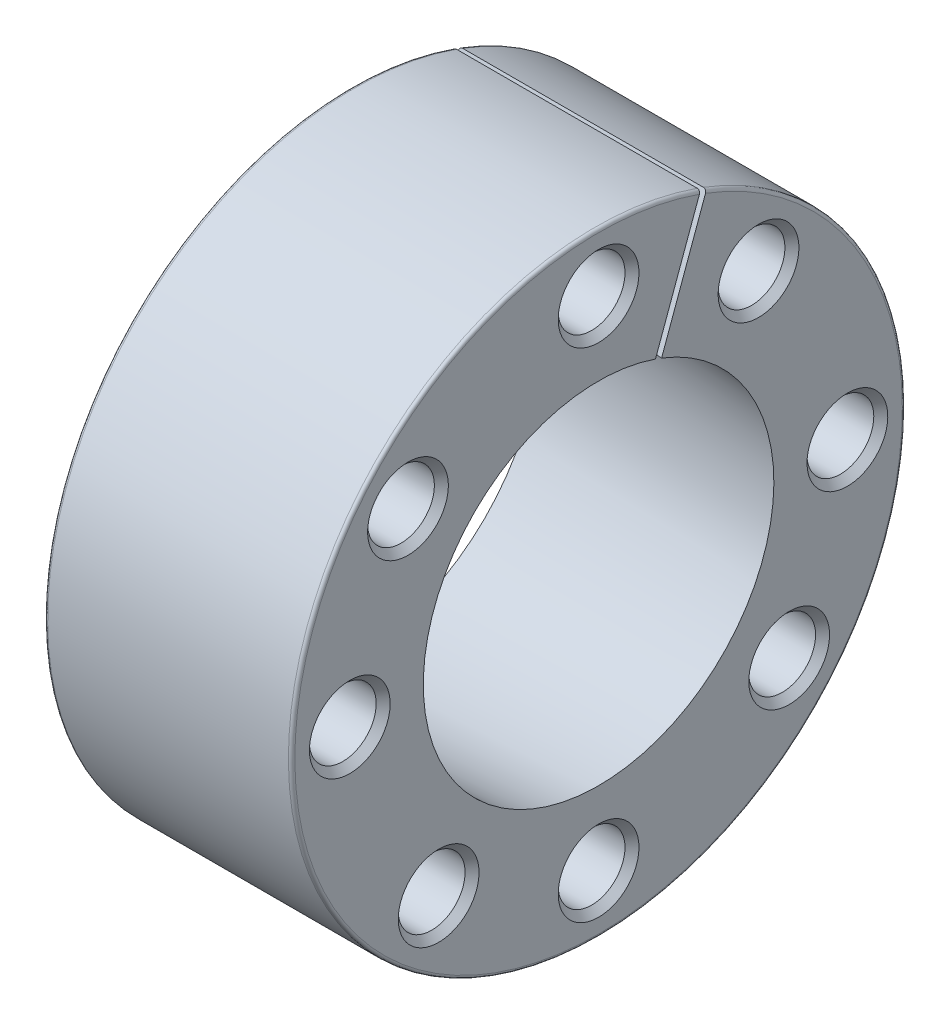
ISO-10303-21;
HEADER;
FILE_DESCRIPTION(('STEP AP214'),'2;1');
FILE_NAME('part.step','',(''),(''),'','','');
FILE_SCHEMA(('AUTOMOTIVE_DESIGN { 1 0 10303 214 1 1 1 1 }'));
ENDSEC;
DATA;
#1=APPLICATION_CONTEXT('core data for automotive mechanical design processes');
#2=APPLICATION_PROTOCOL_DEFINITION('international standard','automotive_design',2000,#1);
#3=PRODUCT_CONTEXT('',#1,'mechanical');
#4=PRODUCT('Part','Part','',(#3));
#5=PRODUCT_RELATED_PRODUCT_CATEGORY('part','',(#4));
#6=PRODUCT_DEFINITION_FORMATION('','',#4);
#7=PRODUCT_DEFINITION_CONTEXT('part definition',#1,'design');
#8=PRODUCT_DEFINITION('design','',#6,#7);
#9=PRODUCT_DEFINITION_SHAPE('','',#8);
#10=(LENGTH_UNIT() NAMED_UNIT(*) SI_UNIT(.MILLI.,.METRE.));
#11=(NAMED_UNIT(*) PLANE_ANGLE_UNIT() SI_UNIT($,.RADIAN.));
#12=(NAMED_UNIT(*) SI_UNIT($,.STERADIAN.) SOLID_ANGLE_UNIT());
#13=UNCERTAINTY_MEASURE_WITH_UNIT(LENGTH_MEASURE(1.E-05),#10,'distance_accuracy_value','');
#14=(GEOMETRIC_REPRESENTATION_CONTEXT(3) GLOBAL_UNCERTAINTY_ASSIGNED_CONTEXT((#13)) GLOBAL_UNIT_ASSIGNED_CONTEXT((#10,
#11,#12)) REPRESENTATION_CONTEXT('',''));
#15=CARTESIAN_POINT('',(0.,0.,0.));
#16=DIRECTION('',(0.,0.,1.));
#17=DIRECTION('',(1.,0.,0.));
#18=AXIS2_PLACEMENT_3D('',#15,#16,#17);
#19=CARTESIAN_POINT('',(24.1,15.4,0.));
#20=DIRECTION('',(-1.,0.,0.));
#21=DIRECTION('',(0.,0.,1.));
#22=AXIS2_PLACEMENT_3D('',#19,#20,#21);
#23=CYLINDRICAL_SURFACE('',#22,2.067);
#24=CARTESIAN_POINT('',(9.23299999999472,15.4,0.));
#25=DIRECTION('',(-1.,0.,0.));
#26=DIRECTION('',(0.,0.,1.));
#27=AXIS2_PLACEMENT_3D('',#24,#25,#26);
#28=CIRCLE('',#27,2.06700000001092);
#29=CARTESIAN_POINT('',(9.23299999999472,15.4,2.06700000001092));
#30=VERTEX_POINT('',#29);
#31=EDGE_CURVE('E222',#30,#30,#28,.T.);
#32=ORIENTED_EDGE('',*,*,#31,.T.);
#33=EDGE_LOOP('',(#32));
#34=FACE_BOUND('',#33,.T.);
#35=CARTESIAN_POINT('',(23.6669999999322,15.4,0.));
#36=DIRECTION('',(1.,0.,0.));
#37=DIRECTION('',(0.,0.,-1.));
#38=AXIS2_PLACEMENT_3D('',#35,#36,#37);
#39=CIRCLE('',#38,2.06700000001092);
#40=CARTESIAN_POINT('',(23.6669999999322,15.4,-2.06700000001092));
#41=VERTEX_POINT('',#40);
#42=EDGE_CURVE('E182',#41,#41,#39,.T.);
#43=ORIENTED_EDGE('',*,*,#42,.T.);
#44=EDGE_LOOP('',(#43));
#45=FACE_BOUND('',#44,.T.);
#46=ADVANCED_FACE('F16',(#34,#45),#23,.F.);
#47=CARTESIAN_POINT('',(24.1,11.7970844240323,-9.8989291891727));
#48=DIRECTION('',(-1.,0.,0.));
#49=DIRECTION('',(0.,0.,1.));
#50=AXIS2_PLACEMENT_3D('',#47,#48,#49);
#51=CYLINDRICAL_SURFACE('',#50,2.067);
#52=CARTESIAN_POINT('',(9.23299999993787,11.7970844240323,-9.8989291891727));
#53=DIRECTION('',(-1.,0.,0.));
#54=DIRECTION('',(0.,0.,1.));
#55=AXIS2_PLACEMENT_3D('',#52,#53,#54);
#56=CIRCLE('',#55,2.06700000003514);
#57=CARTESIAN_POINT('',(9.23299999993787,11.7970844240323,-7.83192918913755));
#58=VERTEX_POINT('',#57);
#59=EDGE_CURVE('E217',#58,#58,#56,.T.);
#60=ORIENTED_EDGE('',*,*,#59,.T.);
#61=EDGE_LOOP('',(#60));
#62=FACE_BOUND('',#61,.T.);
#63=CARTESIAN_POINT('',(23.6669999999322,11.7970844240323,-9.8989291891727));
#64=DIRECTION('',(1.,0.,0.));
#65=DIRECTION('',(0.,0.,-1.));
#66=AXIS2_PLACEMENT_3D('',#63,#64,#65);
#67=CIRCLE('',#66,2.06700000004354);
#68=CARTESIAN_POINT('',(23.6669999999322,11.7970844240323,-11.9659291892162));
#69=VERTEX_POINT('',#68);
#70=EDGE_CURVE('E177',#69,#69,#67,.T.);
#71=ORIENTED_EDGE('',*,*,#70,.T.);
#72=EDGE_LOOP('',(#71));
#73=FACE_BOUND('',#72,.T.);
#74=ADVANCED_FACE('F359',(#62,#73),#51,.F.);
#75=CARTESIAN_POINT('',(24.1,-9.8989291891727,-11.7970844240323));
#76=DIRECTION('',(-1.,0.,0.));
#77=DIRECTION('',(0.,0.,1.));
#78=AXIS2_PLACEMENT_3D('',#75,#76,#77);
#79=CYLINDRICAL_SURFACE('',#78,2.067);
#80=CARTESIAN_POINT('',(9.23299999999472,-9.8989291891727,-11.7970844240323));
#81=DIRECTION('',(-1.,0.,0.));
#82=DIRECTION('',(0.,0.,1.));
#83=AXIS2_PLACEMENT_3D('',#80,#81,#82);
#84=CIRCLE('',#83,2.06699999991192);
#85=CARTESIAN_POINT('',(9.23299999999472,-9.8989291891727,-9.73008442412038));
#86=VERTEX_POINT('',#85);
#87=EDGE_CURVE('E212',#86,#86,#84,.T.);
#88=ORIENTED_EDGE('',*,*,#87,.T.);
#89=EDGE_LOOP('',(#88));
#90=FACE_BOUND('',#89,.T.);
#91=CARTESIAN_POINT('',(23.6669999999322,-9.8989291891727,-11.7970844240323));
#92=DIRECTION('',(1.,0.,0.));
#93=DIRECTION('',(0.,0.,-1.));
#94=AXIS2_PLACEMENT_3D('',#91,#92,#93);
#95=CIRCLE('',#94,2.06700000005308);
#96=CARTESIAN_POINT('',(23.6669999999322,-9.8989291891727,-13.8640844240854));
#97=VERTEX_POINT('',#96);
#98=EDGE_CURVE('E172',#97,#97,#95,.T.);
#99=ORIENTED_EDGE('',*,*,#98,.T.);
#100=EDGE_LOOP('',(#99));
#101=FACE_BOUND('',#100,.T.);
#102=ADVANCED_FACE('F356',(#90,#101),#79,.F.);
#103=CARTESIAN_POINT('',(24.1,-11.7970844240323,9.8989291891727));
#104=DIRECTION('',(-1.,0.,0.));
#105=DIRECTION('',(0.,0.,1.));
#106=AXIS2_PLACEMENT_3D('',#103,#104,#105);
#107=CYLINDRICAL_SURFACE('',#106,2.067);
#108=CARTESIAN_POINT('',(9.23299999999472,-11.7970844240323,9.8989291891727));
#109=DIRECTION('',(-1.,0.,0.));
#110=DIRECTION('',(0.,0.,1.));
#111=AXIS2_PLACEMENT_3D('',#108,#109,#110);
#112=CIRCLE('',#111,2.06699999992985);
#113=CARTESIAN_POINT('',(9.23299999999472,-11.7970844240323,11.9659291891026));
#114=VERTEX_POINT('',#113);
#115=EDGE_CURVE('E207',#114,#114,#112,.T.);
#116=ORIENTED_EDGE('',*,*,#115,.T.);
#117=EDGE_LOOP('',(#116));
#118=FACE_BOUND('',#117,.T.);
#119=CARTESIAN_POINT('',(23.6669999999322,-11.7970844240323,9.8989291891727));
#120=DIRECTION('',(1.,0.,0.));
#121=DIRECTION('',(0.,0.,-1.));
#122=AXIS2_PLACEMENT_3D('',#119,#120,#121);
#123=CIRCLE('',#122,2.06700000003514);
#124=CARTESIAN_POINT('',(23.6669999999322,-11.7970844240323,7.83192918913755));
#125=VERTEX_POINT('',#124);
#126=EDGE_CURVE('E167',#125,#125,#123,.T.);
#127=ORIENTED_EDGE('',*,*,#126,.T.);
#128=EDGE_LOOP('',(#127));
#129=FACE_BOUND('',#128,.T.);
#130=ADVANCED_FACE('F352',(#118,#129),#107,.F.);
#131=CARTESIAN_POINT('',(24.1,9.8989291891727,11.7970844240323));
#132=DIRECTION('',(-1.,0.,0.));
#133=DIRECTION('',(0.,0.,1.));
#134=AXIS2_PLACEMENT_3D('',#131,#132,#133);
#135=CYLINDRICAL_SURFACE('',#134,2.067);
#136=CARTESIAN_POINT('',(9.23299999993787,9.8989291891727,11.7970844240323));
#137=DIRECTION('',(-1.,0.,0.));
#138=DIRECTION('',(0.,0.,1.));
#139=AXIS2_PLACEMENT_3D('',#136,#137,#138);
#140=CIRCLE('',#139,2.06699999999623);
#141=CARTESIAN_POINT('',(9.23299999993787,9.8989291891727,13.8640844240285));
#142=VERTEX_POINT('',#141);
#143=EDGE_CURVE('E202',#142,#142,#140,.T.);
#144=ORIENTED_EDGE('',*,*,#143,.T.);
#145=EDGE_LOOP('',(#144));
#146=FACE_BOUND('',#145,.T.);
#147=CARTESIAN_POINT('',(23.6669999999322,9.8989291891727,11.7970844240323));
#148=DIRECTION('',(1.,0.,0.));
#149=DIRECTION('',(0.,0.,-1.));
#150=AXIS2_PLACEMENT_3D('',#147,#148,#149);
#151=CIRCLE('',#150,2.06700000008245);
#152=CARTESIAN_POINT('',(23.6669999999322,9.8989291891727,9.73008442394985));
#153=VERTEX_POINT('',#152);
#154=EDGE_CURVE('E162',#153,#153,#151,.T.);
#155=ORIENTED_EDGE('',*,*,#154,.T.);
#156=EDGE_LOOP('',(#155));
#157=FACE_BOUND('',#156,.T.);
#158=ADVANCED_FACE('F348',(#146,#157),#135,.F.);
#159=CARTESIAN_POINT('',(24.1,0.,15.4));
#160=DIRECTION('',(-1.,0.,0.));
#161=DIRECTION('',(0.,0.,1.));
#162=AXIS2_PLACEMENT_3D('',#159,#160,#161);
#163=CYLINDRICAL_SURFACE('',#162,2.067);
#164=CARTESIAN_POINT('',(9.23299999999472,0.,15.4));
#165=DIRECTION('',(-1.,0.,0.));
#166=DIRECTION('',(0.,0.,1.));
#167=AXIS2_PLACEMENT_3D('',#164,#165,#166);
#168=CIRCLE('',#167,2.06700000001056);
#169=CARTESIAN_POINT('',(9.23299999999472,0.,17.4670000000106));
#170=VERTEX_POINT('',#169);
#171=EDGE_CURVE('E197',#170,#170,#168,.T.);
#172=ORIENTED_EDGE('',*,*,#171,.T.);
#173=EDGE_LOOP('',(#172));
#174=FACE_BOUND('',#173,.T.);
#175=CARTESIAN_POINT('',(23.6669999999322,0.,15.4));
#176=DIRECTION('',(1.,0.,0.));
#177=DIRECTION('',(0.,0.,-1.));
#178=AXIS2_PLACEMENT_3D('',#175,#176,#177);
#179=CIRCLE('',#178,2.06700000006813);
#180=CARTESIAN_POINT('',(23.6669999999322,0.,13.3329999999319));
#181=VERTEX_POINT('',#180);
#182=EDGE_CURVE('E157',#181,#181,#179,.T.);
#183=ORIENTED_EDGE('',*,*,#182,.T.);
#184=EDGE_LOOP('',(#183));
#185=FACE_BOUND('',#184,.T.);
#186=ADVANCED_FACE('F344',(#174,#185),#163,.F.);
#187=CARTESIAN_POINT('',(24.1,-15.4,0.));
#188=DIRECTION('',(-1.,0.,0.));
#189=DIRECTION('',(0.,0.,1.));
#190=AXIS2_PLACEMENT_3D('',#187,#188,#189);
#191=CYLINDRICAL_SURFACE('',#190,2.067);
#192=CARTESIAN_POINT('',(9.23299999999472,-15.4,0.));
#193=DIRECTION('',(-1.,0.,0.));
#194=DIRECTION('',(0.,0.,1.));
#195=AXIS2_PLACEMENT_3D('',#192,#193,#194);
#196=CIRCLE('',#195,2.06700000001092);
#197=CARTESIAN_POINT('',(9.23299999999472,-15.4,2.06700000001092));
#198=VERTEX_POINT('',#197);
#199=EDGE_CURVE('E192',#198,#198,#196,.T.);
#200=ORIENTED_EDGE('',*,*,#199,.T.);
#201=EDGE_LOOP('',(#200));
#202=FACE_BOUND('',#201,.T.);
#203=CARTESIAN_POINT('',(23.6669999999322,-15.4,0.));
#204=DIRECTION('',(1.,0.,0.));
#205=DIRECTION('',(0.,0.,-1.));
#206=AXIS2_PLACEMENT_3D('',#203,#204,#205);
#207=CIRCLE('',#206,2.06700000001092);
#208=CARTESIAN_POINT('',(23.6669999999322,-15.4,-2.06700000001092));
#209=VERTEX_POINT('',#208);
#210=EDGE_CURVE('E152',#209,#209,#207,.T.);
#211=ORIENTED_EDGE('',*,*,#210,.T.);
#212=EDGE_LOOP('',(#211));
#213=FACE_BOUND('',#212,.T.);
#214=ADVANCED_FACE('F340',(#202,#213),#191,.F.);
#215=CARTESIAN_POINT('',(24.1,0.,-15.4));
#216=DIRECTION('',(-1.,0.,0.));
#217=DIRECTION('',(0.,0.,1.));
#218=AXIS2_PLACEMENT_3D('',#215,#216,#217);
#219=CYLINDRICAL_SURFACE('',#218,2.067);
#220=CARTESIAN_POINT('',(9.23299999993787,0.,-15.4));
#221=DIRECTION('',(-1.,0.,0.));
#222=DIRECTION('',(0.,0.,1.));
#223=AXIS2_PLACEMENT_3D('',#220,#221,#222);
#224=CIRCLE('',#223,2.06700000001129);
#225=CARTESIAN_POINT('',(9.23299999993787,0.,-13.3329999999887));
#226=VERTEX_POINT('',#225);
#227=EDGE_CURVE('E187',#226,#226,#224,.T.);
#228=ORIENTED_EDGE('',*,*,#227,.T.);
#229=EDGE_LOOP('',(#228));
#230=FACE_BOUND('',#229,.T.);
#231=CARTESIAN_POINT('',(23.6669999999322,0.,-15.4));
#232=DIRECTION('',(1.,0.,0.));
#233=DIRECTION('',(0.,0.,-1.));
#234=AXIS2_PLACEMENT_3D('',#231,#232,#233);
#235=CIRCLE('',#234,2.0670000000674);
#236=CARTESIAN_POINT('',(23.6669999999322,0.,-17.4670000000674));
#237=VERTEX_POINT('',#236);
#238=EDGE_CURVE('E144',#237,#237,#235,.T.);
#239=ORIENTED_EDGE('',*,*,#238,.T.);
#240=EDGE_LOOP('',(#239));
#241=FACE_BOUND('',#240,.T.);
#242=ADVANCED_FACE('F336',(#230,#241),#219,.F.);
#243=CARTESIAN_POINT('',(8.79999999995107,15.4,0.));
#244=DIRECTION('',(-1.,0.,0.));
#245=DIRECTION('',(0.,0.,1.));
#246=AXIS2_PLACEMENT_3D('',#243,#244,#245);
#247=CONICAL_SURFACE('',#246,2.50000000005457,0.785398163397448);
#248=CARTESIAN_POINT('',(8.79999999995107,15.4,0.));
#249=DIRECTION('',(-1.,0.,0.));
#250=DIRECTION('',(0.,0.,1.));
#251=AXIS2_PLACEMENT_3D('',#248,#249,#250);
#252=CIRCLE('',#251,2.50000000005457);
#253=CARTESIAN_POINT('',(8.79999999995107,15.4,2.50000000005457));
#254=VERTEX_POINT('',#253);
#255=EDGE_CURVE('E19',#254,#254,#252,.F.);
#256=ORIENTED_EDGE('',*,*,#255,.F.);
#257=EDGE_LOOP('',(#256));
#258=FACE_BOUND('',#257,.T.);
#259=ORIENTED_EDGE('',*,*,#31,.F.);
#260=EDGE_LOOP('',(#259));
#261=FACE_BOUND('',#260,.T.);
#262=ADVANCED_FACE('F332',(#258,#261),#247,.F.);
#263=CARTESIAN_POINT('',(8.8000000001216,11.7970844240323,-9.8989291891727));
#264=DIRECTION('',(-1.,0.,0.));
#265=DIRECTION('',(0.,0.,1.));
#266=AXIS2_PLACEMENT_3D('',#263,#264,#265);
#267=CONICAL_SURFACE('',#266,2.49999999990826,0.785398163397448);
#268=CARTESIAN_POINT('',(8.80000000000791,11.7970844240323,-9.8989291891727));
#269=DIRECTION('',(-1.,0.,0.));
#270=DIRECTION('',(0.,0.,1.));
#271=AXIS2_PLACEMENT_3D('',#268,#269,#270);
#272=CIRCLE('',#271,2.50000000002195);
#273=CARTESIAN_POINT('',(8.80000000000791,11.7970844240323,-7.39892918915075));
#274=VERTEX_POINT('',#273);
#275=EDGE_CURVE('E429',#274,#274,#272,.F.);
#276=ORIENTED_EDGE('',*,*,#275,.F.);
#277=EDGE_LOOP('',(#276));
#278=FACE_BOUND('',#277,.T.);
#279=ORIENTED_EDGE('',*,*,#59,.F.);
#280=EDGE_LOOP('',(#279));
#281=FACE_BOUND('',#280,.T.);
#282=ADVANCED_FACE('F328',(#278,#281),#267,.F.);
#283=CARTESIAN_POINT('',(8.80000000006476,-9.8989291891727,-11.7970844240323));
#284=DIRECTION('',(-1.,0.,0.));
#285=DIRECTION('',(0.,0.,1.));
#286=AXIS2_PLACEMENT_3D('',#283,#284,#285);
#287=CONICAL_SURFACE('',#286,2.49999999984189,0.785398163397448);
#288=CARTESIAN_POINT('',(8.80000000000791,-9.8989291891727,-11.7970844240323));
#289=DIRECTION('',(-1.,0.,0.));
#290=DIRECTION('',(0.,0.,1.));
#291=AXIS2_PLACEMENT_3D('',#288,#289,#290);
#292=CIRCLE('',#291,2.49999999989873);
#293=CARTESIAN_POINT('',(8.80000000000791,-9.8989291891727,-9.29708442413357));
#294=VERTEX_POINT('',#293);
#295=EDGE_CURVE('E427',#294,#294,#292,.F.);
#296=ORIENTED_EDGE('',*,*,#295,.F.);
#297=EDGE_LOOP('',(#296));
#298=FACE_BOUND('',#297,.T.);
#299=ORIENTED_EDGE('',*,*,#87,.F.);
#300=EDGE_LOOP('',(#299));
#301=FACE_BOUND('',#300,.T.);
#302=ADVANCED_FACE('F324',(#298,#301),#287,.F.);
#303=CARTESIAN_POINT('',(8.80000000006476,-11.7970844240323,9.8989291891727));
#304=DIRECTION('',(-1.,0.,0.));
#305=DIRECTION('',(0.,0.,1.));
#306=AXIS2_PLACEMENT_3D('',#303,#304,#305);
#307=CONICAL_SURFACE('',#306,2.49999999985982,0.785398163331809);
#308=CARTESIAN_POINT('',(8.80000000000791,-11.7970844240323,9.8989291891727));
#309=DIRECTION('',(-1.,0.,0.));
#310=DIRECTION('',(0.,0.,1.));
#311=AXIS2_PLACEMENT_3D('',#308,#309,#310);
#312=CIRCLE('',#311,2.49999999991666);
#313=CARTESIAN_POINT('',(8.80000000000791,-11.7970844240323,12.3989291890894));
#314=VERTEX_POINT('',#313);
#315=EDGE_CURVE('E424',#314,#314,#312,.F.);
#316=ORIENTED_EDGE('',*,*,#315,.F.);
#317=EDGE_LOOP('',(#316));
#318=FACE_BOUND('',#317,.T.);
#319=ORIENTED_EDGE('',*,*,#115,.F.);
#320=EDGE_LOOP('',(#319));
#321=FACE_BOUND('',#320,.T.);
#322=ADVANCED_FACE('F320',(#318,#321),#307,.F.);
#323=CARTESIAN_POINT('',(8.80000000000791,9.8989291891727,11.7970844240323));
#324=DIRECTION('',(-1.,0.,0.));
#325=DIRECTION('',(0.,0.,1.));
#326=AXIS2_PLACEMENT_3D('',#323,#324,#325);
#327=CONICAL_SURFACE('',#326,2.49999999992619,0.785398163397448);
#328=CARTESIAN_POINT('',(8.79999999995107,9.8989291891727,11.7970844240323));
#329=DIRECTION('',(-1.,0.,0.));
#330=DIRECTION('',(0.,0.,1.));
#331=AXIS2_PLACEMENT_3D('',#328,#329,#330);
#332=CIRCLE('',#331,2.49999999998304);
#333=CARTESIAN_POINT('',(8.79999999995107,9.8989291891727,14.2970844240153));
#334=VERTEX_POINT('',#333);
#335=EDGE_CURVE('E421',#334,#334,#332,.F.);
#336=ORIENTED_EDGE('',*,*,#335,.F.);
#337=EDGE_LOOP('',(#336));
#338=FACE_BOUND('',#337,.T.);
#339=ORIENTED_EDGE('',*,*,#143,.F.);
#340=EDGE_LOOP('',(#339));
#341=FACE_BOUND('',#340,.T.);
#342=ADVANCED_FACE('F316',(#338,#341),#327,.F.);
#343=CARTESIAN_POINT('',(8.80000000000791,0.,15.4));
#344=DIRECTION('',(-1.,0.,0.));
#345=DIRECTION('',(0.,0.,1.));
#346=AXIS2_PLACEMENT_3D('',#343,#344,#345);
#347=CONICAL_SURFACE('',#346,2.50000000005421,0.785398163463087);
#348=CARTESIAN_POINT('',(8.80000000000791,0.,15.4));
#349=DIRECTION('',(-1.,0.,0.));
#350=DIRECTION('',(0.,0.,1.));
#351=AXIS2_PLACEMENT_3D('',#348,#349,#350);
#352=CIRCLE('',#351,2.50000000005421);
#353=CARTESIAN_POINT('',(8.80000000000791,0.,17.9000000000542));
#354=VERTEX_POINT('',#353);
#355=EDGE_CURVE('E418',#354,#354,#352,.F.);
#356=ORIENTED_EDGE('',*,*,#355,.F.);
#357=EDGE_LOOP('',(#356));
#358=FACE_BOUND('',#357,.T.);
#359=ORIENTED_EDGE('',*,*,#171,.F.);
#360=EDGE_LOOP('',(#359));
#361=FACE_BOUND('',#360,.T.);
#362=ADVANCED_FACE('F312',(#358,#361),#347,.F.);
#363=CARTESIAN_POINT('',(8.79999999995107,-15.4,0.));
#364=DIRECTION('',(-1.,0.,0.));
#365=DIRECTION('',(0.,0.,1.));
#366=AXIS2_PLACEMENT_3D('',#363,#364,#365);
#367=CONICAL_SURFACE('',#366,2.50000000005457,0.785398163397448);
#368=CARTESIAN_POINT('',(8.79999999995107,-15.4,0.));
#369=DIRECTION('',(-1.,0.,0.));
#370=DIRECTION('',(0.,0.,1.));
#371=AXIS2_PLACEMENT_3D('',#368,#369,#370);
#372=CIRCLE('',#371,2.50000000005457);
#373=CARTESIAN_POINT('',(8.79999999995107,-15.4,2.50000000005457));
#374=VERTEX_POINT('',#373);
#375=EDGE_CURVE('E415',#374,#374,#372,.F.);
#376=ORIENTED_EDGE('',*,*,#375,.F.);
#377=EDGE_LOOP('',(#376));
#378=FACE_BOUND('',#377,.T.);
#379=ORIENTED_EDGE('',*,*,#199,.F.);
#380=EDGE_LOOP('',(#379));
#381=FACE_BOUND('',#380,.T.);
#382=ADVANCED_FACE('F308',(#378,#381),#367,.F.);
#383=CARTESIAN_POINT('',(8.79999999989423,0.,-15.4));
#384=DIRECTION('',(-1.,0.,0.));
#385=DIRECTION('',(0.,0.,1.));
#386=AXIS2_PLACEMENT_3D('',#383,#384,#385);
#387=CONICAL_SURFACE('',#386,2.49999999999809,0.785398163397448);
#388=CARTESIAN_POINT('',(8.79999999989423,0.,-15.4));
#389=DIRECTION('',(-1.,0.,0.));
#390=DIRECTION('',(0.,0.,1.));
#391=AXIS2_PLACEMENT_3D('',#388,#389,#390);
#392=CIRCLE('',#391,2.49999999999809);
#393=CARTESIAN_POINT('',(8.79999999989423,0.,-12.9000000000019));
#394=VERTEX_POINT('',#393);
#395=EDGE_CURVE('E88',#394,#394,#392,.F.);
#396=ORIENTED_EDGE('',*,*,#395,.F.);
#397=EDGE_LOOP('',(#396));
#398=FACE_BOUND('',#397,.T.);
#399=ORIENTED_EDGE('',*,*,#227,.F.);
#400=EDGE_LOOP('',(#399));
#401=FACE_BOUND('',#400,.T.);
#402=ADVANCED_FACE('F304',(#398,#401),#387,.F.);
#403=CARTESIAN_POINT('',(24.0999999999758,15.4,0.));
#404=DIRECTION('',(1.,0.,0.));
#405=DIRECTION('',(0.,0.,-1.));
#406=AXIS2_PLACEMENT_3D('',#403,#404,#405);
#407=CONICAL_SURFACE('',#406,2.49999999999773,0.785398163331809);
#408=ORIENTED_EDGE('',*,*,#42,.F.);
#409=EDGE_LOOP('',(#408));
#410=FACE_BOUND('',#409,.T.);
#411=CARTESIAN_POINT('',(24.0999999999758,15.4,0.));
#412=DIRECTION('',(1.,0.,0.));
#413=DIRECTION('',(0.,0.,-1.));
#414=AXIS2_PLACEMENT_3D('',#411,#412,#413);
#415=CIRCLE('',#414,2.49999999999773);
#416=CARTESIAN_POINT('',(24.0999999999758,15.4,-2.49999999999773));
#417=VERTEX_POINT('',#416);
#418=EDGE_CURVE('E409',#417,#417,#415,.F.);
#419=ORIENTED_EDGE('',*,*,#418,.F.);
#420=EDGE_LOOP('',(#419));
#421=FACE_BOUND('',#420,.T.);
#422=ADVANCED_FACE('F300',(#410,#421),#407,.F.);
#423=CARTESIAN_POINT('',(24.099999999919,11.7970844240323,-9.8989291891727));
#424=DIRECTION('',(1.,0.,0.));
#425=DIRECTION('',(0.,1.,0.));
#426=AXIS2_PLACEMENT_3D('',#423,#424,#425);
#427=CONICAL_SURFACE('',#426,2.4999999999735,0.785398163397448);
#428=ORIENTED_EDGE('',*,*,#70,.F.);
#429=EDGE_LOOP('',(#428));
#430=FACE_BOUND('',#429,.T.);
#431=CARTESIAN_POINT('',(24.0999999999758,11.7970844240323,-9.8989291891727));
#432=DIRECTION('',(1.,0.,0.));
#433=DIRECTION('',(0.,1.,0.));
#434=AXIS2_PLACEMENT_3D('',#431,#432,#433);
#435=CIRCLE('',#434,2.50000000003035);
#436=CARTESIAN_POINT('',(24.0999999999758,14.2970844240626,-9.8989291891727));
#437=VERTEX_POINT('',#436);
#438=EDGE_CURVE('E406',#437,#437,#435,.F.);
#439=ORIENTED_EDGE('',*,*,#438,.F.);
#440=EDGE_LOOP('',(#439));
#441=FACE_BOUND('',#440,.T.);
#442=ADVANCED_FACE('F296',(#430,#441),#427,.F.);
#443=CARTESIAN_POINT('',(24.099999999919,-9.8989291891727,-11.7970844240323));
#444=DIRECTION('',(1.,0.,0.));
#445=DIRECTION('',(0.,1.,0.));
#446=AXIS2_PLACEMENT_3D('',#443,#444,#445);
#447=CONICAL_SURFACE('',#446,2.49999999998304,0.785398163397448);
#448=ORIENTED_EDGE('',*,*,#98,.F.);
#449=EDGE_LOOP('',(#448));
#450=FACE_BOUND('',#449,.T.);
#451=CARTESIAN_POINT('',(24.0999999999758,-9.8989291891727,-11.7970844240323));
#452=DIRECTION('',(1.,0.,0.));
#453=DIRECTION('',(0.,1.,0.));
#454=AXIS2_PLACEMENT_3D('',#451,#452,#453);
#455=CIRCLE('',#454,2.50000000003988);
#456=CARTESIAN_POINT('',(24.0999999999758,-7.39892918913282,-11.7970844240323));
#457=VERTEX_POINT('',#456);
#458=EDGE_CURVE('E403',#457,#457,#455,.F.);
#459=ORIENTED_EDGE('',*,*,#458,.F.);
#460=EDGE_LOOP('',(#459));
#461=FACE_BOUND('',#460,.T.);
#462=ADVANCED_FACE('F292',(#450,#461),#447,.F.);
#463=CARTESIAN_POINT('',(24.099999999919,-11.7970844240323,9.8989291891727));
#464=DIRECTION('',(1.,0.,0.));
#465=DIRECTION('',(0.,1.,0.));
#466=AXIS2_PLACEMENT_3D('',#463,#464,#465);
#467=CONICAL_SURFACE('',#466,2.49999999996511,0.785398163397448);
#468=ORIENTED_EDGE('',*,*,#126,.F.);
#469=EDGE_LOOP('',(#468));
#470=FACE_BOUND('',#469,.T.);
#471=CARTESIAN_POINT('',(24.0999999999758,-11.7970844240323,9.8989291891727));
#472=DIRECTION('',(1.,0.,0.));
#473=DIRECTION('',(0.,1.,0.));
#474=AXIS2_PLACEMENT_3D('',#471,#472,#473);
#475=CIRCLE('',#474,2.50000000002195);
#476=CARTESIAN_POINT('',(24.0999999999758,-9.29708442401035,9.8989291891727));
#477=VERTEX_POINT('',#476);
#478=EDGE_CURVE('E400',#477,#477,#475,.F.);
#479=ORIENTED_EDGE('',*,*,#478,.F.);
#480=EDGE_LOOP('',(#479));
#481=FACE_BOUND('',#480,.T.);
#482=ADVANCED_FACE('F288',(#470,#481),#467,.F.);
#483=CARTESIAN_POINT('',(24.099999999919,9.8989291891727,11.7970844240323));
#484=DIRECTION('',(1.,0.,0.));
#485=DIRECTION('',(0.,1.,0.));
#486=AXIS2_PLACEMENT_3D('',#483,#484,#485);
#487=CONICAL_SURFACE('',#486,2.50000000001242,0.785398163397448);
#488=ORIENTED_EDGE('',*,*,#154,.F.);
#489=EDGE_LOOP('',(#488));
#490=FACE_BOUND('',#489,.T.);
#491=CARTESIAN_POINT('',(24.099999999919,9.8989291891727,11.7970844240323));
#492=DIRECTION('',(1.,0.,0.));
#493=DIRECTION('',(0.,1.,0.));
#494=AXIS2_PLACEMENT_3D('',#491,#492,#493);
#495=CIRCLE('',#494,2.50000000001242);
#496=CARTESIAN_POINT('',(24.099999999919,12.3989291891851,11.7970844240323));
#497=VERTEX_POINT('',#496);
#498=EDGE_CURVE('E397',#497,#497,#495,.F.);
#499=ORIENTED_EDGE('',*,*,#498,.F.);
#500=EDGE_LOOP('',(#499));
#501=FACE_BOUND('',#500,.T.);
#502=ADVANCED_FACE('F284',(#490,#501),#487,.F.);
#503=CARTESIAN_POINT('',(24.099999999919,0.,15.4));
#504=DIRECTION('',(1.,0.,0.));
#505=DIRECTION('',(0.,1.,0.));
#506=AXIS2_PLACEMENT_3D('',#503,#504,#505);
#507=CONICAL_SURFACE('',#506,2.49999999999809,0.785398163397448);
#508=ORIENTED_EDGE('',*,*,#182,.F.);
#509=EDGE_LOOP('',(#508));
#510=FACE_BOUND('',#509,.T.);
#511=CARTESIAN_POINT('',(24.0999999999758,0.,15.4));
#512=DIRECTION('',(1.,0.,0.));
#513=DIRECTION('',(0.,1.,0.));
#514=AXIS2_PLACEMENT_3D('',#511,#512,#513);
#515=CIRCLE('',#514,2.50000000005493);
#516=CARTESIAN_POINT('',(24.0999999999758,2.50000000005494,15.4));
#517=VERTEX_POINT('',#516);
#518=EDGE_CURVE('E394',#517,#517,#515,.F.);
#519=ORIENTED_EDGE('',*,*,#518,.F.);
#520=EDGE_LOOP('',(#519));
#521=FACE_BOUND('',#520,.T.);
#522=ADVANCED_FACE('F280',(#510,#521),#507,.F.);
#523=CARTESIAN_POINT('',(24.0999999999758,-15.4,0.));
#524=DIRECTION('',(1.,0.,0.));
#525=DIRECTION('',(0.,0.,-1.));
#526=AXIS2_PLACEMENT_3D('',#523,#524,#525);
#527=CONICAL_SURFACE('',#526,2.49999999999773,0.785398163331809);
#528=ORIENTED_EDGE('',*,*,#210,.F.);
#529=EDGE_LOOP('',(#528));
#530=FACE_BOUND('',#529,.T.);
#531=CARTESIAN_POINT('',(24.0999999999758,-15.4,0.));
#532=DIRECTION('',(1.,0.,0.));
#533=DIRECTION('',(0.,0.,-1.));
#534=AXIS2_PLACEMENT_3D('',#531,#532,#533);
#535=CIRCLE('',#534,2.49999999999773);
#536=CARTESIAN_POINT('',(24.0999999999758,-15.4,-2.49999999999773));
#537=VERTEX_POINT('',#536);
#538=EDGE_CURVE('E391',#537,#537,#535,.F.);
#539=ORIENTED_EDGE('',*,*,#538,.F.);
#540=EDGE_LOOP('',(#539));
#541=FACE_BOUND('',#540,.T.);
#542=ADVANCED_FACE('F276',(#530,#541),#527,.F.);
#543=CARTESIAN_POINT('',(24.099999999919,0.,-15.4));
#544=DIRECTION('',(1.,0.,0.));
#545=DIRECTION('',(0.,1.,0.));
#546=AXIS2_PLACEMENT_3D('',#543,#544,#545);
#547=CONICAL_SURFACE('',#546,2.49999999999736,0.785398163397448);
#548=ORIENTED_EDGE('',*,*,#238,.F.);
#549=EDGE_LOOP('',(#548));
#550=FACE_BOUND('',#549,.T.);
#551=CARTESIAN_POINT('',(24.0999999999758,0.,-15.4));
#552=DIRECTION('',(1.,0.,0.));
#553=DIRECTION('',(0.,1.,0.));
#554=AXIS2_PLACEMENT_3D('',#551,#552,#553);
#555=CIRCLE('',#554,2.50000000005421);
#556=CARTESIAN_POINT('',(24.0999999999758,2.5000000000542,-15.4));
#557=VERTEX_POINT('',#556);
#558=EDGE_CURVE('E388',#557,#557,#555,.F.);
#559=ORIENTED_EDGE('',*,*,#558,.F.);
#560=EDGE_LOOP('',(#559));
#561=FACE_BOUND('',#560,.T.);
#562=ADVANCED_FACE('F271',(#550,#561),#547,.F.);
#563=CARTESIAN_POINT('',(8.8,18.8,0.));
#564=DIRECTION('',(-1.,0.,0.));
#565=DIRECTION('',(0.,0.,1.));
#566=AXIS2_PLACEMENT_3D('',#563,#564,#565);
#567=PLANE('',#566);
#568=ORIENTED_EDGE('',*,*,#395,.T.);
#569=EDGE_LOOP('',(#568));
#570=FACE_BOUND('',#569,.T.);
#571=ORIENTED_EDGE('',*,*,#375,.T.);
#572=EDGE_LOOP('',(#571));
#573=FACE_BOUND('',#572,.T.);
#574=ORIENTED_EDGE('',*,*,#355,.T.);
#575=EDGE_LOOP('',(#574));
#576=FACE_BOUND('',#575,.T.);
#577=ORIENTED_EDGE('',*,*,#335,.T.);
#578=EDGE_LOOP('',(#577));
#579=FACE_BOUND('',#578,.T.);
#580=ORIENTED_EDGE('',*,*,#315,.T.);
#581=EDGE_LOOP('',(#580));
#582=FACE_BOUND('',#581,.T.);
#583=ORIENTED_EDGE('',*,*,#295,.T.);
#584=EDGE_LOOP('',(#583));
#585=FACE_BOUND('',#584,.T.);
#586=ORIENTED_EDGE('',*,*,#275,.T.);
#587=EDGE_LOOP('',(#586));
#588=FACE_BOUND('',#587,.T.);
#589=ORIENTED_EDGE('',*,*,#255,.T.);
#590=EDGE_LOOP('',(#589));
#591=FACE_BOUND('',#590,.T.);
#592=DIRECTION('',(0.,-0.939692620785908,0.342020143325669));
#593=VECTOR('',#592,1.);
#594=CARTESIAN_POINT('',(8.79999999999756,-0.0684040286651337,-0.187938524157182));
#595=LINE('',#594,#593);
#596=CARTESIAN_POINT('',(8.79999999999903,17.5968175408237,-6.61755335716841));
#597=VERTEX_POINT('',#596);
#598=CARTESIAN_POINT('',(8.79999999999951,10.9243932049973,-4.18898950853417));
#599=VERTEX_POINT('',#598);
#600=EDGE_CURVE('E83',#597,#599,#595,.T.);
#601=ORIENTED_EDGE('',*,*,#600,.F.);
#602=CARTESIAN_POINT('',(8.80000000000001,0.,0.));
#603=DIRECTION('',(1.,0.,0.));
#604=DIRECTION('',(0.,0.9432779573486,-0.332004058981592));
#605=AXIS2_PLACEMENT_3D('',#602,#603,#604);
#606=CIRCLE('',#605,18.8000000000003);
#607=CARTESIAN_POINT('',(8.79999999999903,17.733625598154,-6.24167630885404));
#608=VERTEX_POINT('',#607);
#609=EDGE_CURVE('E104',#608,#597,#606,.T.);
#610=ORIENTED_EDGE('',*,*,#609,.F.);
#611=DIRECTION('',(0.,-0.939692620785908,0.342020143325669));
#612=VECTOR('',#611,1.);
#613=CARTESIAN_POINT('',(8.79999999999756,0.0684040286651337,0.187938524157182));
#614=LINE('',#613,#612);
#615=CARTESIAN_POINT('',(8.79999999999878,11.0612012623276,-3.81311246021982));
#616=VERTEX_POINT('',#615);
#617=EDGE_CURVE('E62',#608,#616,#614,.T.);
#618=ORIENTED_EDGE('',*,*,#617,.T.);
#619=CARTESIAN_POINT('',(8.8,0.,0.));
#620=DIRECTION('',(-1.,0.,0.));
#621=DIRECTION('',(0.,-1.,0.));
#622=AXIS2_PLACEMENT_3D('',#619,#620,#621);
#623=CIRCLE('',#622,11.7);
#624=EDGE_CURVE('E79',#616,#599,#623,.F.);
#625=ORIENTED_EDGE('',*,*,#624,.T.);
#626=EDGE_LOOP('',(#601,#610,#618,#625));
#627=FACE_BOUND('',#626,.T.);
#628=ADVANCED_FACE('F81',(#570,#573,#576,#579,#582,#585,#588,#591,#627),#567,.T.);
#629=CARTESIAN_POINT('',(8.8,0.,0.));
#630=DIRECTION('',(-1.,0.,0.));
#631=DIRECTION('',(0.,-1.,0.));
#632=AXIS2_PLACEMENT_3D('',#629,#630,#631);
#633=CONICAL_SURFACE('',#632,11.7,0.0554985052457168);
#634=CARTESIAN_POINT('',(24.1,0.,0.));
#635=DIRECTION('',(-1.,0.,0.));
#636=DIRECTION('',(0.,-1.,0.));
#637=AXIS2_PLACEMENT_3D('',#634,#635,#636);
#638=CIRCLE('',#637,10.85);
#639=CARTESIAN_POINT('',(24.1,10.125528607402,-3.89822657380043));
#640=VERTEX_POINT('',#639);
#641=CARTESIAN_POINT('',(24.1,10.2623366647323,-3.52234952548606));
#642=VERTEX_POINT('',#641);
#643=EDGE_CURVE('E87',#640,#642,#638,.T.);
#644=ORIENTED_EDGE('',*,*,#643,.F.);
#645=CARTESIAN_POINT('',(8.79999999999903,10.9243932049973,-4.18898950853418));
#646=CARTESIAN_POINT('',(11.3500000932488,10.7912506824172,-4.14052959339987));
#647=CARTESIAN_POINT('',(13.9000001398738,10.6581073713274,-4.09206939127158));
#648=CARTESIAN_POINT('',(19.0000001398741,10.391819172129,-3.99514841302699));
#649=CARTESIAN_POINT('',(21.5500000932494,10.2586742840203,-3.94668763691071));
#650=CARTESIAN_POINT('',(24.1,10.125528607402,-3.89822657380043));
#651=B_SPLINE_CURVE_WITH_KNOTS('',3,(#645,#646,#647,#648,#649,#650),.UNSPECIFIED.,.F.,.F.,(4,2,
4),(0.,7.66180017570217,15.3236003514044),.UNSPECIFIED.);
#652=EDGE_CURVE('E90',#599,#640,#651,.T.);
#653=ORIENTED_EDGE('',*,*,#652,.F.);
#654=ORIENTED_EDGE('',*,*,#624,.F.);
#655=CARTESIAN_POINT('',(8.79999999999902,11.0612012623276,-3.81311246021981));
#656=CARTESIAN_POINT('',(11.3500000932488,10.9280587397474,-3.76465254508551));
#657=CARTESIAN_POINT('',(13.9000001398737,10.7949154286577,-3.71619234295721));
#658=CARTESIAN_POINT('',(19.0000001398741,10.5286272294593,-3.61927136471263));
#659=CARTESIAN_POINT('',(21.5500000932494,10.3954823413505,-3.57081058859634));
#660=CARTESIAN_POINT('',(24.1,10.2623366647323,-3.52234952548606));
#661=B_SPLINE_CURVE_WITH_KNOTS('',3,(#655,#656,#657,#658,#659,#660),.UNSPECIFIED.,.F.,.F.,(4,2,
4),(0.,7.66180017570217,15.3236003514044),.UNSPECIFIED.);
#662=EDGE_CURVE('E376',#616,#642,#661,.T.);
#663=ORIENTED_EDGE('',*,*,#662,.T.);
#664=EDGE_LOOP('',(#644,#653,#654,#663));
#665=FACE_BOUND('',#664,.T.);
#666=ADVANCED_FACE('F91',(#665),#633,.F.);
#667=CARTESIAN_POINT('',(24.1,10.85,0.));
#668=DIRECTION('',(1.,0.,0.));
#669=DIRECTION('',(0.,0.,-1.));
#670=AXIS2_PLACEMENT_3D('',#667,#668,#669);
#671=PLANE('',#670);
#672=ORIENTED_EDGE('',*,*,#558,.T.);
#673=EDGE_LOOP('',(#672));
#674=FACE_BOUND('',#673,.T.);
#675=ORIENTED_EDGE('',*,*,#538,.T.);
#676=EDGE_LOOP('',(#675));
#677=FACE_BOUND('',#676,.T.);
#678=ORIENTED_EDGE('',*,*,#518,.T.);
#679=EDGE_LOOP('',(#678));
#680=FACE_BOUND('',#679,.T.);
#681=ORIENTED_EDGE('',*,*,#498,.T.);
#682=EDGE_LOOP('',(#681));
#683=FACE_BOUND('',#682,.T.);
#684=ORIENTED_EDGE('',*,*,#478,.T.);
#685=EDGE_LOOP('',(#684));
#686=FACE_BOUND('',#685,.T.);
#687=ORIENTED_EDGE('',*,*,#458,.T.);
#688=EDGE_LOOP('',(#687));
#689=FACE_BOUND('',#688,.T.);
#690=ORIENTED_EDGE('',*,*,#438,.T.);
#691=EDGE_LOOP('',(#690));
#692=FACE_BOUND('',#691,.T.);
#693=ORIENTED_EDGE('',*,*,#418,.T.);
#694=EDGE_LOOP('',(#693));
#695=FACE_BOUND('',#694,.T.);
#696=DIRECTION('',(0.,-0.939692620785908,0.342020143325669));
#697=VECTOR('',#696,1.);
#698=CARTESIAN_POINT('',(24.1,-0.0684040286651337,-0.187938524157182));
#699=LINE('',#698,#697);
#700=CARTESIAN_POINT('',(24.100000000001,17.5968175408232,-6.61755335716821));
#701=VERTEX_POINT('',#700);
#702=EDGE_CURVE('E71',#640,#701,#699,.F.);
#703=ORIENTED_EDGE('',*,*,#702,.F.);
#704=ORIENTED_EDGE('',*,*,#643,.T.);
#705=DIRECTION('',(0.,-0.939692620785908,0.342020143325669));
#706=VECTOR('',#705,1.);
#707=CARTESIAN_POINT('',(24.1,0.0684040286651337,0.187938524157182));
#708=LINE('',#707,#706);
#709=CARTESIAN_POINT('',(24.100000000001,17.7336255981534,-6.24167630885384));
#710=VERTEX_POINT('',#709);
#711=EDGE_CURVE('E76',#642,#710,#708,.F.);
#712=ORIENTED_EDGE('',*,*,#711,.T.);
#713=CARTESIAN_POINT('',(24.1,0.,0.));
#714=DIRECTION('',(-1.,0.,0.));
#715=DIRECTION('',(0.,0.936000933022522,-0.351997518998313));
#716=AXIS2_PLACEMENT_3D('',#713,#714,#715);
#717=CIRCLE('',#716,18.7999999999998);
#718=EDGE_CURVE('E230',#701,#710,#717,.T.);
#719=ORIENTED_EDGE('',*,*,#718,.F.);
#720=EDGE_LOOP('',(#703,#704,#712,#719));
#721=FACE_BOUND('',#720,.T.);
#722=ADVANCED_FACE('F443',(#674,#677,#680,#683,#686,#689,#692,#695,#721),#671,.T.);
#723=CARTESIAN_POINT('',(0.,0.0684040286651337,0.187938524157182));
#724=DIRECTION('',(0.,0.342020143325669,0.939692620785908));
#725=DIRECTION('',(0.,-0.939692620785908,0.342020143325669));
#726=AXIS2_PLACEMENT_3D('',#723,#724,#725);
#727=PLANE('',#726);
#728=ORIENTED_EDGE('',*,*,#617,.F.);
#729=CARTESIAN_POINT('',(9.00000000000001,17.9215746460684,-6.31008416785359));
#730=CARTESIAN_POINT('',(8.98874879270312,17.9215836283746,-6.31008743714559));
#731=CARTESIAN_POINT('',(8.97750044422197,17.9206829686532,-6.30975962381581));
#732=CARTESIAN_POINT('',(8.95533056757511,17.9171286526689,-6.30846595859447));
#733=CARTESIAN_POINT('',(8.94440878951828,17.9144763745882,-6.30750060832015));
#734=CARTESIAN_POINT('',(8.92318939987622,17.9074832406445,-6.30495531572039));
#735=CARTESIAN_POINT('',(8.91289209040338,17.9031415748856,-6.30337507861694));
#736=CARTESIAN_POINT('',(8.89322092609489,17.8928967289957,-6.29964625965835));
#737=CARTESIAN_POINT('',(8.88384690938676,17.8869938232537,-6.29749777767268));
#738=CARTESIAN_POINT('',(8.86628535422225,17.8737922398077,-6.29269279425314));
#739=CARTESIAN_POINT('',(8.8580979586875,17.866493394216,-6.29003623171317));
#740=CARTESIAN_POINT('',(8.84314339958329,17.8507076046388,-6.28429067418269));
#741=CARTESIAN_POINT('',(8.83637621377897,17.8422206792575,-6.28120168596353));
#742=CARTESIAN_POINT('',(8.82445200522594,17.8242975688349,-6.27467820726423));
#743=CARTESIAN_POINT('',(8.81929555280994,17.8148610491188,-6.27124359497247));
#744=CARTESIAN_POINT('',(8.81074434091936,17.7953103433757,-6.26412772002303));
#745=CARTESIAN_POINT('',(8.8073485510439,17.7851965576306,-6.26044660305614));
#746=CARTESIAN_POINT('',(8.80325856300008,17.7681217151745,-6.25423186864732));
#747=CARTESIAN_POINT('',(8.80203734018095,17.7612680337698,-6.25173733262084));
#748=CARTESIAN_POINT('',(8.80040816588448,17.7474857248457,-6.24672098241299));
#749=CARTESIAN_POINT('',(8.7999990614746,17.7405572176337,-6.24419921201991));
#750=CARTESIAN_POINT('',(8.80000000000001,17.733625598154,-6.24167630885406));
#751=B_SPLINE_CURVE_WITH_KNOTS('',3,(#729,#730,#731,#732,#733,#734,#735,#736,#737,#738,#739,
#740,#741,#742,#743,#744,#745,#746,#747,#748,#749,#750),.UNSPECIFIED.,.F.,.F.,(4,2,2,2,2,2,2,2,
2,2,4),(0.,0.0337087736552426,0.0673910566270721,0.101089506888436,0.134782038553121,
0.168478624920971,0.202174683694506,0.23588266016823,0.269570887233153,0.291713987076814,
0.313825628687209),.UNSPECIFIED.);
#752=CARTESIAN_POINT('',(9.,17.9215746460684,-6.31008416785358));
#753=VERTEX_POINT('',#752);
#754=EDGE_CURVE('E375',#753,#608,#751,.T.);
#755=ORIENTED_EDGE('',*,*,#754,.F.);
#756=DIRECTION('',(-1.,0.,0.));
#757=VECTOR('',#756,1.);
#758=CARTESIAN_POINT('',(50.,17.9215746460685,-6.31008416785357));
#759=LINE('',#758,#757);
#760=CARTESIAN_POINT('',(23.9,17.9215746460685,-6.31008416785359));
#761=VERTEX_POINT('',#760);
#762=EDGE_CURVE('E110',#761,#753,#759,.T.);
#763=ORIENTED_EDGE('',*,*,#762,.F.);
#764=CARTESIAN_POINT('',(24.1,17.7336255981534,-6.24167630885385));
#765=CARTESIAN_POINT('',(24.1000095540864,17.744199724143,-6.24552497596739));
#766=CARTESIAN_POINT('',(24.0990509959385,17.754771170771,-6.24937266787313));
#767=CARTESIAN_POINT('',(24.0952681520309,17.7756069579546,-6.25695627421551));
#768=CARTESIAN_POINT('',(24.0924453270489,17.7858715323881,-6.26069227377673));
#769=CARTESIAN_POINT('',(24.0850024542248,17.8058140937661,-6.26795077251334));
#770=CARTESIAN_POINT('',(24.0803815423771,17.8154917961225,-6.27147316810712));
#771=CARTESIAN_POINT('',(24.0694776672671,17.8339792648493,-6.27820205643062));
#772=CARTESIAN_POINT('',(24.0631949975728,17.8427891841462,-6.28140860482104));
#773=CARTESIAN_POINT('',(24.0491443054336,17.8592933996329,-6.2874156479981));
#774=CARTESIAN_POINT('',(24.0413761778833,17.8669876168121,-6.29021611402725));
#775=CARTESIAN_POINT('',(24.0245753570256,17.8810411644471,-6.29533118705224));
#776=CARTESIAN_POINT('',(24.015542684692,17.8874005170387,-6.29764580210488));
#777=CARTESIAN_POINT('',(23.9964679828329,17.8986051409249,-6.3017239516856));
#778=CARTESIAN_POINT('',(23.9864257027905,17.903450035201,-6.30348734899019));
#779=CARTESIAN_POINT('',(23.9656200375601,17.9114841738669,-6.30641153632255));
#780=CARTESIAN_POINT('',(23.9548570794846,17.9146743892722,-6.30757267977109));
#781=CARTESIAN_POINT('',(23.9366901632043,17.9185154147042,-6.30897069869737));
#782=CARTESIAN_POINT('',(23.929400528235,17.9196619333312,-6.30938799735057));
#783=CARTESIAN_POINT('',(23.9147416145457,17.9211914477653,-6.3099446950774));
#784=CARTESIAN_POINT('',(23.9073724636951,17.9215755260418,-6.31008448813764));
#785=CARTESIAN_POINT('',(23.9,17.9215746460685,-6.31008416785359));
#786=B_SPLINE_CURVE_WITH_KNOTS('',3,(#764,#765,#766,#767,#768,#769,#770,#771,#772,#773,#774,
#775,#776,#777,#778,#779,#780,#781,#782,#783,#784,#785),.UNSPECIFIED.,.F.,.F.,(4,2,2,2,2,2,2,2,
2,2,4),(0.,0.0337134108751711,0.0674004363325759,0.101103668905019,0.134800951401999,
0.168500619071675,0.202199727860788,0.235907219242084,0.269594907605043,0.291725970119107,
0.31382558967689),.UNSPECIFIED.);
#787=EDGE_CURVE('E92',#710,#761,#786,.T.);
#788=ORIENTED_EDGE('',*,*,#787,.F.);
#789=ORIENTED_EDGE('',*,*,#711,.F.);
#790=ORIENTED_EDGE('',*,*,#662,.F.);
#791=EDGE_LOOP('',(#728,#755,#763,#788,#789,#790));
#792=FACE_BOUND('',#791,.T.);
#793=ADVANCED_FACE('F122',(#792),#727,.F.);
#794=CARTESIAN_POINT('',(9.00000000000001,0.,0.));
#795=DIRECTION('',(1.,0.,0.));
#796=DIRECTION('',(0.,0.,-1.));
#797=AXIS2_PLACEMENT_3D('',#794,#795,#796);
#798=TOROIDAL_SURFACE('',#797,18.8,0.200000000000002);
#799=CARTESIAN_POINT('',(9.00000000000001,17.7847665887382,-6.68596121616795));
#800=CARTESIAN_POINT('',(8.98874879270312,17.7847755710443,-6.68596448546011));
#801=CARTESIAN_POINT('',(8.97750044422197,17.7838749113229,-6.68563667213027));
#802=CARTESIAN_POINT('',(8.95533056757511,17.7803205953387,-6.68434300690875));
#803=CARTESIAN_POINT('',(8.94440878951828,17.777668317258,-6.6833776566343));
#804=CARTESIAN_POINT('',(8.92318939987622,17.7706751833143,-6.68083236403459));
#805=CARTESIAN_POINT('',(8.91289209040338,17.7663335175554,-6.6792521269313));
#806=CARTESIAN_POINT('',(8.89322092609489,17.7560886716654,-6.67552330797272));
#807=CARTESIAN_POINT('',(8.88384690938676,17.7501857659235,-6.67337482598688));
#808=CARTESIAN_POINT('',(8.86628535422226,17.7369841824774,-6.66856984256734));
#809=CARTESIAN_POINT('',(8.8580979586875,17.7296853368857,-6.66591328002752));
#810=CARTESIAN_POINT('',(8.84314339958329,17.7138995473086,-6.66016772249708));
#811=CARTESIAN_POINT('',(8.83637621377897,17.7054126219273,-6.65707873427778));
#812=CARTESIAN_POINT('',(8.82445200522594,17.6874895115047,-6.65055525557847));
#813=CARTESIAN_POINT('',(8.81929555280995,17.6780529917886,-6.64712064328682));
#814=CARTESIAN_POINT('',(8.81074434091936,17.6585022860454,-6.64000476833742));
#815=CARTESIAN_POINT('',(8.8073485510439,17.6483885003004,-6.63632365137045));
#816=CARTESIAN_POINT('',(8.80325856300008,17.6313136578443,-6.63010891696163));
#817=CARTESIAN_POINT('',(8.80203734018095,17.6244599764395,-6.62761438093518));
#818=CARTESIAN_POINT('',(8.80040816588448,17.6106776675154,-6.62259803072737));
#819=CARTESIAN_POINT('',(8.7999990614746,17.6037491603034,-6.6200762603343));
#820=CARTESIAN_POINT('',(8.80000000000001,17.5968175408237,-6.61755335716841));
#821=B_SPLINE_CURVE_WITH_KNOTS('',3,(#799,#800,#801,#802,#803,#804,#805,#806,#807,#808,#809,
#810,#811,#812,#813,#814,#815,#816,#817,#818,#819,#820),.UNSPECIFIED.,.F.,.F.,(4,2,2,2,2,2,2,2,
2,2,4),(0.,0.0337087736552429,0.0673910566270719,0.101089506888435,0.134782038553119,
0.16847862492097,0.2021746836945,0.235882660168221,0.269570887233151,0.291713987076825,
0.313825628687235),.UNSPECIFIED.);
#822=CARTESIAN_POINT('',(9.,17.7847665887382,-6.68596121616795));
#823=VERTEX_POINT('',#822);
#824=EDGE_CURVE('E95',#823,#597,#821,.T.);
#825=ORIENTED_EDGE('',*,*,#824,.F.);
#826=CARTESIAN_POINT('',(9.,0.,0.));
#827=DIRECTION('',(-1.,0.,0.));
#828=DIRECTION('',(0.,0.,1.));
#829=AXIS2_PLACEMENT_3D('',#826,#827,#828);
#830=CIRCLE('',#829,19.);
#831=EDGE_CURVE('E107',#753,#823,#830,.F.);
#832=ORIENTED_EDGE('',*,*,#831,.F.);
#833=ORIENTED_EDGE('',*,*,#754,.T.);
#834=ORIENTED_EDGE('',*,*,#609,.T.);
#835=EDGE_LOOP('',(#825,#832,#833,#834));
#836=FACE_BOUND('',#835,.T.);
#837=ADVANCED_FACE('F117',(#836),#798,.T.);
#838=CARTESIAN_POINT('',(0.,-0.0684040286651337,-0.187938524157182));
#839=DIRECTION('',(0.,0.342020143325669,0.939692620785908));
#840=DIRECTION('',(0.,-0.939692620785908,0.342020143325669));
#841=AXIS2_PLACEMENT_3D('',#838,#839,#840);
#842=PLANE('',#841);
#843=ORIENTED_EDGE('',*,*,#600,.T.);
#844=ORIENTED_EDGE('',*,*,#652,.T.);
#845=ORIENTED_EDGE('',*,*,#702,.T.);
#846=CARTESIAN_POINT('',(23.9,17.7847665887382,-6.68596121616795));
#847=CARTESIAN_POINT('',(23.9112512072969,17.7847755710443,-6.68596448546007));
#848=CARTESIAN_POINT('',(23.922499555778,17.7838749113229,-6.68563667213025));
#849=CARTESIAN_POINT('',(23.9446694324249,17.7803205953387,-6.68434300690877));
#850=CARTESIAN_POINT('',(23.9555912104817,17.777668317258,-6.68337765663436));
#851=CARTESIAN_POINT('',(23.9768106001238,17.7706751833143,-6.68083236403463));
#852=CARTESIAN_POINT('',(23.9871079095966,17.7663335175554,-6.67925212693131));
#853=CARTESIAN_POINT('',(24.0067790739051,17.7560886716654,-6.67552330797272));
#854=CARTESIAN_POINT('',(24.0161530906132,17.7501857659235,-6.67337482598692));
#855=CARTESIAN_POINT('',(24.0337146457777,17.7369841824774,-6.66856984256738));
#856=CARTESIAN_POINT('',(24.0419020413125,17.7296853368857,-6.66591328002753));
#857=CARTESIAN_POINT('',(24.0568566004167,17.7138995473086,-6.66016772249707));
#858=CARTESIAN_POINT('',(24.063623786221,17.7054126219273,-6.65707873427781));
#859=CARTESIAN_POINT('',(24.0755479947741,17.6874895115047,-6.6505552555785));
#860=CARTESIAN_POINT('',(24.0807044471901,17.6780529917886,-6.64712064328682));
#861=CARTESIAN_POINT('',(24.0892556590806,17.6585022860454,-6.64000476833742));
#862=CARTESIAN_POINT('',(24.0926514489561,17.6483885003004,-6.63632365137047));
#863=CARTESIAN_POINT('',(24.096741437,17.6313136578442,-6.63010891696162));
#864=CARTESIAN_POINT('',(24.0979626598191,17.6244599764394,-6.62761438093513));
#865=CARTESIAN_POINT('',(24.0995918341156,17.6106776675151,-6.62259803072724));
#866=CARTESIAN_POINT('',(24.1000009385254,17.603749160303,-6.62007626033414));
#867=CARTESIAN_POINT('',(24.1,17.5968175408232,-6.61755335716823));
#868=B_SPLINE_CURVE_WITH_KNOTS('',3,(#846,#847,#848,#849,#850,#851,#852,#853,#854,#855,#856,
#857,#858,#859,#860,#861,#862,#863,#864,#865,#866,#867),.UNSPECIFIED.,.F.,.F.,(4,2,2,2,2,2,2,2,
2,2,4),(0.,0.0337087736552394,0.0673910566270675,0.101089506888428,0.134782038553115,
0.168478624920968,0.202174683694507,0.235882660168227,0.269570887233152,0.2917139870771,
0.313825628687787),.UNSPECIFIED.);
#869=CARTESIAN_POINT('',(23.9,17.7847665887382,-6.68596121616795));
#870=VERTEX_POINT('',#869);
#871=EDGE_CURVE('E34',#870,#701,#868,.T.);
#872=ORIENTED_EDGE('',*,*,#871,.F.);
#873=DIRECTION('',(-1.,0.,0.));
#874=VECTOR('',#873,1.);
#875=CARTESIAN_POINT('',(50.,17.7847665887382,-6.68596121616794));
#876=LINE('',#875,#874);
#877=EDGE_CURVE('E25',#823,#870,#876,.F.);
#878=ORIENTED_EDGE('',*,*,#877,.F.);
#879=ORIENTED_EDGE('',*,*,#824,.T.);
#880=EDGE_LOOP('',(#843,#844,#845,#872,#878,#879));
#881=FACE_BOUND('',#880,.T.);
#882=ADVANCED_FACE('F94',(#881),#842,.T.);
#883=CARTESIAN_POINT('',(23.9,0.,0.));
#884=DIRECTION('',(1.,0.,0.));
#885=DIRECTION('',(0.,0.,-1.));
#886=AXIS2_PLACEMENT_3D('',#883,#884,#885);
#887=TOROIDAL_SURFACE('',#886,18.8,0.200000000000006);
#888=ORIENTED_EDGE('',*,*,#871,.T.);
#889=ORIENTED_EDGE('',*,*,#718,.T.);
#890=ORIENTED_EDGE('',*,*,#787,.T.);
#891=CARTESIAN_POINT('',(23.9,0.,0.));
#892=DIRECTION('',(-1.,0.,0.));
#893=DIRECTION('',(0.,0.,1.));
#894=AXIS2_PLACEMENT_3D('',#891,#892,#893);
#895=CIRCLE('',#894,19.);
#896=EDGE_CURVE('E11',#870,#761,#895,.T.);
#897=ORIENTED_EDGE('',*,*,#896,.F.);
#898=EDGE_LOOP('',(#888,#889,#890,#897));
#899=FACE_BOUND('',#898,.T.);
#900=ADVANCED_FACE('F238',(#899),#887,.T.);
#901=CARTESIAN_POINT('',(50.,0.,0.));
#902=DIRECTION('',(-1.,0.,0.));
#903=DIRECTION('',(0.,0.,1.));
#904=AXIS2_PLACEMENT_3D('',#901,#902,#903);
#905=CYLINDRICAL_SURFACE('',#904,19.);
#906=ORIENTED_EDGE('',*,*,#877,.T.);
#907=ORIENTED_EDGE('',*,*,#896,.T.);
#908=ORIENTED_EDGE('',*,*,#762,.T.);
#909=ORIENTED_EDGE('',*,*,#831,.T.);
#910=EDGE_LOOP('',(#906,#907,#908,#909));
#911=FACE_BOUND('',#910,.T.);
#912=ADVANCED_FACE('F242',(#911),#905,.T.);
#913=CLOSED_SHELL('',(#46,#74,#102,#130,#158,#186,#214,#242,#262,#282,#302,#322,#342,#362,#382,
#402,#422,#442,#462,#482,#502,#522,#542,#562,#628,#666,#722,#793,#837,#882,#900,#912));
#914=MANIFOLD_SOLID_BREP('B1',#913);
#915=ADVANCED_BREP_SHAPE_REPRESENTATION('',(#18,#914),#14);
#916=SHAPE_DEFINITION_REPRESENTATION(#9,#915);
ENDSEC;
END-ISO-10303-21;
